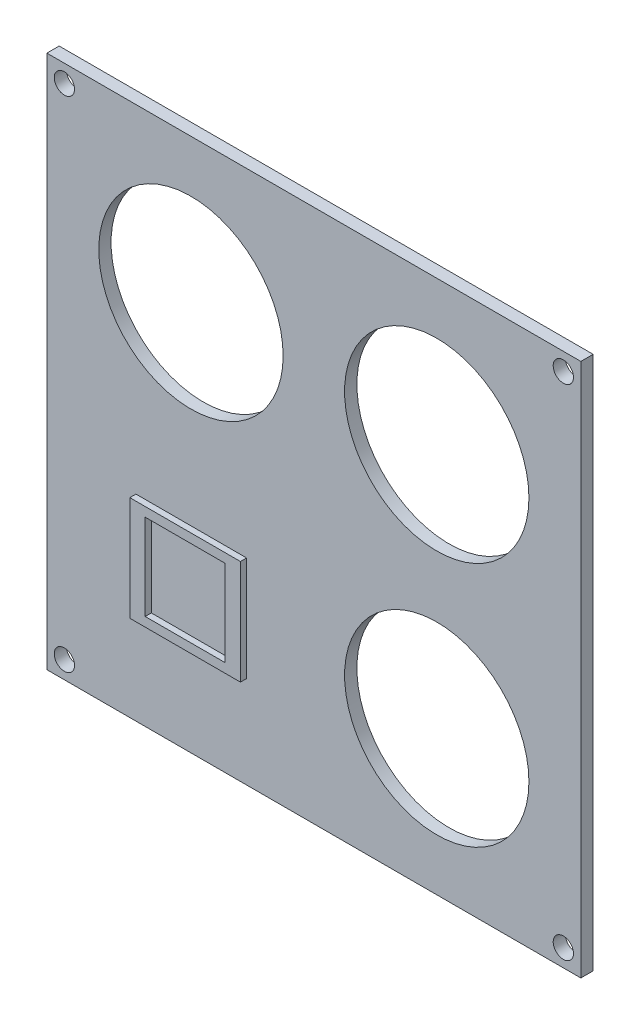
ISO-10303-21;
HEADER;
FILE_DESCRIPTION(('STEP AP214'),'2;1');
FILE_NAME('part.step','',(''),(''),'','','');
FILE_SCHEMA(('AUTOMOTIVE_DESIGN { 1 0 10303 214 1 1 1 1 }'));
ENDSEC;
DATA;
#1=APPLICATION_CONTEXT('core data for automotive mechanical design processes');
#2=APPLICATION_PROTOCOL_DEFINITION('international standard','automotive_design',2000,#1);
#3=PRODUCT_CONTEXT('',#1,'mechanical');
#4=PRODUCT('Part','Part','',(#3));
#5=PRODUCT_RELATED_PRODUCT_CATEGORY('part','',(#4));
#6=PRODUCT_DEFINITION_FORMATION('','',#4);
#7=PRODUCT_DEFINITION_CONTEXT('part definition',#1,'design');
#8=PRODUCT_DEFINITION('design','',#6,#7);
#9=PRODUCT_DEFINITION_SHAPE('','',#8);
#10=(LENGTH_UNIT() NAMED_UNIT(*) SI_UNIT(.MILLI.,.METRE.));
#11=(NAMED_UNIT(*) PLANE_ANGLE_UNIT() SI_UNIT($,.RADIAN.));
#12=(NAMED_UNIT(*) SI_UNIT($,.STERADIAN.) SOLID_ANGLE_UNIT());
#13=UNCERTAINTY_MEASURE_WITH_UNIT(LENGTH_MEASURE(1.E-05),#10,'distance_accuracy_value','');
#14=(GEOMETRIC_REPRESENTATION_CONTEXT(3) GLOBAL_UNCERTAINTY_ASSIGNED_CONTEXT((#13)) GLOBAL_UNIT_ASSIGNED_CONTEXT((#10,
#11,#12)) REPRESENTATION_CONTEXT('',''));
#15=CARTESIAN_POINT('',(0.,0.,0.));
#16=DIRECTION('',(0.,0.,1.));
#17=DIRECTION('',(1.,0.,0.));
#18=AXIS2_PLACEMENT_3D('',#15,#16,#17);
#19=CARTESIAN_POINT('',(0.,0.,2.));
#20=DIRECTION('',(0.,0.,-1.));
#21=DIRECTION('',(-1.,0.,0.));
#22=AXIS2_PLACEMENT_3D('',#19,#20,#21);
#23=PLANE('',#22);
#24=CARTESIAN_POINT('',(-63.45,63.45,2.));
#25=DIRECTION('',(0.,0.,1.));
#26=DIRECTION('',(1.,0.,0.));
#27=AXIS2_PLACEMENT_3D('',#24,#25,#26);
#28=CIRCLE('',#27,15.);
#29=CARTESIAN_POINT('',(-48.45,63.45,2.));
#30=VERTEX_POINT('',#29);
#31=EDGE_CURVE('E519',#30,#30,#28,.T.);
#32=ORIENTED_EDGE('',*,*,#31,.F.);
#33=EDGE_LOOP('',(#32));
#34=FACE_BOUND('',#33,.T.);
#35=CARTESIAN_POINT('',(-23.45,63.45,2.));
#36=DIRECTION('',(0.,0.,1.));
#37=DIRECTION('',(1.,0.,0.));
#38=AXIS2_PLACEMENT_3D('',#35,#36,#37);
#39=CIRCLE('',#38,15.);
#40=CARTESIAN_POINT('',(-8.44999999999999,63.45,2.));
#41=VERTEX_POINT('',#40);
#42=EDGE_CURVE('E522',#41,#41,#39,.T.);
#43=ORIENTED_EDGE('',*,*,#42,.F.);
#44=EDGE_LOOP('',(#43));
#45=FACE_BOUND('',#44,.T.);
#46=CARTESIAN_POINT('',(-23.45,23.45,2.));
#47=DIRECTION('',(0.,0.,1.));
#48=DIRECTION('',(1.,0.,0.));
#49=AXIS2_PLACEMENT_3D('',#46,#47,#48);
#50=CIRCLE('',#49,15.);
#51=CARTESIAN_POINT('',(-8.44999999999999,23.45,2.));
#52=VERTEX_POINT('',#51);
#53=EDGE_CURVE('E535',#52,#52,#50,.T.);
#54=ORIENTED_EDGE('',*,*,#53,.F.);
#55=EDGE_LOOP('',(#54));
#56=FACE_BOUND('',#55,.T.);
#57=DIRECTION('',(-1.,0.,0.));
#58=VECTOR('',#57,1.);
#59=CARTESIAN_POINT('',(0.,0.,2.));
#60=LINE('',#59,#58);
#61=CARTESIAN_POINT('',(0.,0.,2.));
#62=VERTEX_POINT('',#61);
#63=CARTESIAN_POINT('',(-86.9,0.,2.));
#64=VERTEX_POINT('',#63);
#65=EDGE_CURVE('E264',#62,#64,#60,.T.);
#66=ORIENTED_EDGE('',*,*,#65,.F.);
#67=DIRECTION('',(0.,1.,0.));
#68=VECTOR('',#67,1.);
#69=CARTESIAN_POINT('',(0.,0.,2.));
#70=LINE('',#69,#68);
#71=CARTESIAN_POINT('',(0.,86.9,2.));
#72=VERTEX_POINT('',#71);
#73=EDGE_CURVE('E280',#62,#72,#70,.T.);
#74=ORIENTED_EDGE('',*,*,#73,.T.);
#75=DIRECTION('',(-1.,0.,0.));
#76=VECTOR('',#75,1.);
#77=CARTESIAN_POINT('',(0.,86.9,2.));
#78=LINE('',#77,#76);
#79=CARTESIAN_POINT('',(-86.9,86.9,2.));
#80=VERTEX_POINT('',#79);
#81=EDGE_CURVE('E273',#72,#80,#78,.T.);
#82=ORIENTED_EDGE('',*,*,#81,.T.);
#83=DIRECTION('',(0.,1.,0.));
#84=VECTOR('',#83,1.);
#85=CARTESIAN_POINT('',(-86.9,0.,2.));
#86=LINE('',#85,#84);
#87=EDGE_CURVE('E267',#64,#80,#86,.T.);
#88=ORIENTED_EDGE('',*,*,#87,.F.);
#89=EDGE_LOOP('',(#66,#74,#82,#88));
#90=FACE_BOUND('',#89,.T.);
#91=CARTESIAN_POINT('',(-84.05,2.85000000000001,2.));
#92=DIRECTION('',(0.,0.,1.));
#93=DIRECTION('',(1.,0.,0.));
#94=AXIS2_PLACEMENT_3D('',#91,#92,#93);
#95=CIRCLE('',#94,1.65);
#96=CARTESIAN_POINT('',(-82.4,2.85000000000001,2.));
#97=VERTEX_POINT('',#96);
#98=EDGE_CURVE('E240',#97,#97,#95,.T.);
#99=ORIENTED_EDGE('',*,*,#98,.F.);
#100=EDGE_LOOP('',(#99));
#101=FACE_BOUND('',#100,.T.);
#102=CARTESIAN_POINT('',(-2.85,2.84999999999999,2.));
#103=DIRECTION('',(0.,0.,1.));
#104=DIRECTION('',(1.,0.,0.));
#105=AXIS2_PLACEMENT_3D('',#102,#103,#104);
#106=CIRCLE('',#105,1.65);
#107=CARTESIAN_POINT('',(-1.2,2.84999999999999,2.));
#108=VERTEX_POINT('',#107);
#109=EDGE_CURVE('E234',#108,#108,#106,.T.);
#110=ORIENTED_EDGE('',*,*,#109,.F.);
#111=EDGE_LOOP('',(#110));
#112=FACE_BOUND('',#111,.T.);
#113=CARTESIAN_POINT('',(-2.84999999999997,84.05,2.));
#114=DIRECTION('',(0.,0.,1.));
#115=DIRECTION('',(1.,0.,0.));
#116=AXIS2_PLACEMENT_3D('',#113,#114,#115);
#117=CIRCLE('',#116,1.65);
#118=CARTESIAN_POINT('',(-1.19999999999997,84.05,2.));
#119=VERTEX_POINT('',#118);
#120=EDGE_CURVE('E245',#119,#119,#117,.T.);
#121=ORIENTED_EDGE('',*,*,#120,.F.);
#122=EDGE_LOOP('',(#121));
#123=FACE_BOUND('',#122,.T.);
#124=CARTESIAN_POINT('',(-84.05,84.05,2.));
#125=DIRECTION('',(0.,0.,1.));
#126=DIRECTION('',(1.,0.,0.));
#127=AXIS2_PLACEMENT_3D('',#124,#125,#126);
#128=CIRCLE('',#127,1.65);
#129=CARTESIAN_POINT('',(-82.4,84.05,2.));
#130=VERTEX_POINT('',#129);
#131=EDGE_CURVE('E248',#130,#130,#128,.T.);
#132=ORIENTED_EDGE('',*,*,#131,.F.);
#133=EDGE_LOOP('',(#132));
#134=FACE_BOUND('',#133,.T.);
#135=DIRECTION('',(0.,-1.,0.));
#136=VECTOR('',#135,1.);
#137=CARTESIAN_POINT('',(-72.3999999999999,14.9999999999999,2.));
#138=LINE('',#137,#136);
#139=CARTESIAN_POINT('',(-72.3999999999999,31.9999999999999,2.));
#140=VERTEX_POINT('',#139);
#141=CARTESIAN_POINT('',(-72.3999999999999,14.9999999999999,2.));
#142=VERTEX_POINT('',#141);
#143=EDGE_CURVE('E72',#140,#142,#138,.T.);
#144=ORIENTED_EDGE('',*,*,#143,.F.);
#145=DIRECTION('',(-1.,0.,0.));
#146=VECTOR('',#145,1.);
#147=CARTESIAN_POINT('',(-72.3999999999999,31.9999999999999,2.));
#148=LINE('',#147,#146);
#149=CARTESIAN_POINT('',(-54.3999999999999,31.9999999999999,2.));
#150=VERTEX_POINT('',#149);
#151=EDGE_CURVE('E193',#150,#140,#148,.T.);
#152=ORIENTED_EDGE('',*,*,#151,.F.);
#153=DIRECTION('',(0.,1.,0.));
#154=VECTOR('',#153,1.);
#155=CARTESIAN_POINT('',(-54.3999999999999,14.9999999999999,2.));
#156=LINE('',#155,#154);
#157=CARTESIAN_POINT('',(-54.3999999999999,14.9999999999999,2.));
#158=VERTEX_POINT('',#157);
#159=EDGE_CURVE('E211',#158,#150,#156,.T.);
#160=ORIENTED_EDGE('',*,*,#159,.F.);
#161=DIRECTION('',(1.,0.,0.));
#162=VECTOR('',#161,1.);
#163=CARTESIAN_POINT('',(-72.3999999999999,14.9999999999999,2.));
#164=LINE('',#163,#162);
#165=EDGE_CURVE('E210',#142,#158,#164,.T.);
#166=ORIENTED_EDGE('',*,*,#165,.F.);
#167=EDGE_LOOP('',(#144,#152,#160,#166));
#168=FACE_BOUND('',#167,.T.);
#169=ADVANCED_FACE('F44',(#34,#45,#56,#90,#101,#112,#123,#134,#168),#23,.F.);
#170=CARTESIAN_POINT('',(0.,0.,2.));
#171=DIRECTION('',(0.,-1.,0.));
#172=DIRECTION('',(0.,0.,-1.));
#173=AXIS2_PLACEMENT_3D('',#170,#171,#172);
#174=PLANE('',#173);
#175=DIRECTION('',(-1.,0.,0.));
#176=VECTOR('',#175,1.);
#177=CARTESIAN_POINT('',(0.,0.,0.));
#178=LINE('',#177,#176);
#179=CARTESIAN_POINT('',(0.,0.,0.));
#180=VERTEX_POINT('',#179);
#181=CARTESIAN_POINT('',(-86.9,0.,0.));
#182=VERTEX_POINT('',#181);
#183=EDGE_CURVE('E261',#180,#182,#178,.T.);
#184=ORIENTED_EDGE('',*,*,#183,.F.);
#185=DIRECTION('',(0.,0.,-1.));
#186=VECTOR('',#185,1.);
#187=CARTESIAN_POINT('',(0.,0.,2.));
#188=LINE('',#187,#186);
#189=EDGE_CURVE('E11',#62,#180,#188,.T.);
#190=ORIENTED_EDGE('',*,*,#189,.F.);
#191=ORIENTED_EDGE('',*,*,#65,.T.);
#192=DIRECTION('',(0.,0.,-1.));
#193=VECTOR('',#192,1.);
#194=CARTESIAN_POINT('',(-86.9,0.,2.));
#195=LINE('',#194,#193);
#196=EDGE_CURVE('E47',#64,#182,#195,.T.);
#197=ORIENTED_EDGE('',*,*,#196,.T.);
#198=EDGE_LOOP('',(#184,#190,#191,#197));
#199=FACE_BOUND('',#198,.T.);
#200=ADVANCED_FACE('F50',(#199),#174,.T.);
#201=CARTESIAN_POINT('',(0.,0.,2.));
#202=DIRECTION('',(-1.,0.,0.));
#203=DIRECTION('',(0.,0.,1.));
#204=AXIS2_PLACEMENT_3D('',#201,#202,#203);
#205=PLANE('',#204);
#206=DIRECTION('',(0.,1.,0.));
#207=VECTOR('',#206,1.);
#208=CARTESIAN_POINT('',(0.,0.,0.));
#209=LINE('',#208,#207);
#210=CARTESIAN_POINT('',(0.,86.9,0.));
#211=VERTEX_POINT('',#210);
#212=EDGE_CURVE('E269',#180,#211,#209,.T.);
#213=ORIENTED_EDGE('',*,*,#212,.T.);
#214=DIRECTION('',(0.,0.,-1.));
#215=VECTOR('',#214,1.);
#216=CARTESIAN_POINT('',(0.,86.9,2.));
#217=LINE('',#216,#215);
#218=EDGE_CURVE('E54',#72,#211,#217,.T.);
#219=ORIENTED_EDGE('',*,*,#218,.F.);
#220=ORIENTED_EDGE('',*,*,#73,.F.);
#221=ORIENTED_EDGE('',*,*,#189,.T.);
#222=EDGE_LOOP('',(#213,#219,#220,#221));
#223=FACE_BOUND('',#222,.T.);
#224=ADVANCED_FACE('F315',(#223),#205,.F.);
#225=CARTESIAN_POINT('',(0.,86.9,2.));
#226=DIRECTION('',(0.,-1.,0.));
#227=DIRECTION('',(0.,0.,-1.));
#228=AXIS2_PLACEMENT_3D('',#225,#226,#227);
#229=PLANE('',#228);
#230=DIRECTION('',(-1.,0.,0.));
#231=VECTOR('',#230,1.);
#232=CARTESIAN_POINT('',(0.,86.9,0.));
#233=LINE('',#232,#231);
#234=CARTESIAN_POINT('',(-86.9,86.9,0.));
#235=VERTEX_POINT('',#234);
#236=EDGE_CURVE('E290',#211,#235,#233,.T.);
#237=ORIENTED_EDGE('',*,*,#236,.T.);
#238=DIRECTION('',(0.,0.,-1.));
#239=VECTOR('',#238,1.);
#240=CARTESIAN_POINT('',(-86.9,86.9,2.));
#241=LINE('',#240,#239);
#242=EDGE_CURVE('E293',#80,#235,#241,.T.);
#243=ORIENTED_EDGE('',*,*,#242,.F.);
#244=ORIENTED_EDGE('',*,*,#81,.F.);
#245=ORIENTED_EDGE('',*,*,#218,.T.);
#246=EDGE_LOOP('',(#237,#243,#244,#245));
#247=FACE_BOUND('',#246,.T.);
#248=ADVANCED_FACE('F316',(#247),#229,.F.);
#249=CARTESIAN_POINT('',(-86.9,0.,2.));
#250=DIRECTION('',(-1.,0.,0.));
#251=DIRECTION('',(0.,0.,1.));
#252=AXIS2_PLACEMENT_3D('',#249,#250,#251);
#253=PLANE('',#252);
#254=DIRECTION('',(0.,1.,0.));
#255=VECTOR('',#254,1.);
#256=CARTESIAN_POINT('',(-86.9,0.,0.));
#257=LINE('',#256,#255);
#258=EDGE_CURVE('E283',#182,#235,#257,.T.);
#259=ORIENTED_EDGE('',*,*,#258,.F.);
#260=ORIENTED_EDGE('',*,*,#196,.F.);
#261=ORIENTED_EDGE('',*,*,#87,.T.);
#262=ORIENTED_EDGE('',*,*,#242,.T.);
#263=EDGE_LOOP('',(#259,#260,#261,#262));
#264=FACE_BOUND('',#263,.T.);
#265=ADVANCED_FACE('F303',(#264),#253,.T.);
#266=CARTESIAN_POINT('',(0.,0.,0.));
#267=DIRECTION('',(0.,0.,-1.));
#268=DIRECTION('',(-1.,0.,0.));
#269=AXIS2_PLACEMENT_3D('',#266,#267,#268);
#270=PLANE('',#269);
#271=CARTESIAN_POINT('',(-63.45,63.45,0.));
#272=DIRECTION('',(0.,0.,1.));
#273=DIRECTION('',(1.,0.,0.));
#274=AXIS2_PLACEMENT_3D('',#271,#272,#273);
#275=CIRCLE('',#274,15.);
#276=CARTESIAN_POINT('',(-48.45,63.45,0.));
#277=VERTEX_POINT('',#276);
#278=EDGE_CURVE('E177',#277,#277,#275,.T.);
#279=ORIENTED_EDGE('',*,*,#278,.T.);
#280=EDGE_LOOP('',(#279));
#281=FACE_BOUND('',#280,.T.);
#282=CARTESIAN_POINT('',(-23.45,63.45,0.));
#283=DIRECTION('',(0.,0.,1.));
#284=DIRECTION('',(1.,0.,0.));
#285=AXIS2_PLACEMENT_3D('',#282,#283,#284);
#286=CIRCLE('',#285,15.);
#287=CARTESIAN_POINT('',(-8.44999999999999,63.45,0.));
#288=VERTEX_POINT('',#287);
#289=EDGE_CURVE('E527',#288,#288,#286,.T.);
#290=ORIENTED_EDGE('',*,*,#289,.T.);
#291=EDGE_LOOP('',(#290));
#292=FACE_BOUND('',#291,.T.);
#293=CARTESIAN_POINT('',(-23.45,23.45,0.));
#294=DIRECTION('',(0.,0.,1.));
#295=DIRECTION('',(1.,0.,0.));
#296=AXIS2_PLACEMENT_3D('',#293,#294,#295);
#297=CIRCLE('',#296,15.);
#298=CARTESIAN_POINT('',(-8.44999999999999,23.45,0.));
#299=VERTEX_POINT('',#298);
#300=EDGE_CURVE('E167',#299,#299,#297,.T.);
#301=ORIENTED_EDGE('',*,*,#300,.T.);
#302=EDGE_LOOP('',(#301));
#303=FACE_BOUND('',#302,.T.);
#304=CARTESIAN_POINT('',(-84.05,84.05,0.));
#305=DIRECTION('',(0.,0.,1.));
#306=DIRECTION('',(1.,0.,0.));
#307=AXIS2_PLACEMENT_3D('',#304,#305,#306);
#308=CIRCLE('',#307,1.65);
#309=CARTESIAN_POINT('',(-82.4,84.05,0.));
#310=VERTEX_POINT('',#309);
#311=EDGE_CURVE('E235',#310,#310,#308,.T.);
#312=ORIENTED_EDGE('',*,*,#311,.T.);
#313=EDGE_LOOP('',(#312));
#314=FACE_BOUND('',#313,.T.);
#315=CARTESIAN_POINT('',(-2.84999999999997,84.05,0.));
#316=DIRECTION('',(0.,0.,1.));
#317=DIRECTION('',(1.,0.,0.));
#318=AXIS2_PLACEMENT_3D('',#315,#316,#317);
#319=CIRCLE('',#318,1.65);
#320=CARTESIAN_POINT('',(-1.19999999999997,84.05,0.));
#321=VERTEX_POINT('',#320);
#322=EDGE_CURVE('E247',#321,#321,#319,.T.);
#323=ORIENTED_EDGE('',*,*,#322,.T.);
#324=EDGE_LOOP('',(#323));
#325=FACE_BOUND('',#324,.T.);
#326=CARTESIAN_POINT('',(-2.85,2.84999999999999,0.));
#327=DIRECTION('',(0.,0.,1.));
#328=DIRECTION('',(1.,0.,0.));
#329=AXIS2_PLACEMENT_3D('',#326,#327,#328);
#330=CIRCLE('',#329,1.65);
#331=CARTESIAN_POINT('',(-1.2,2.84999999999999,0.));
#332=VERTEX_POINT('',#331);
#333=EDGE_CURVE('E236',#332,#332,#330,.T.);
#334=ORIENTED_EDGE('',*,*,#333,.T.);
#335=EDGE_LOOP('',(#334));
#336=FACE_BOUND('',#335,.T.);
#337=CARTESIAN_POINT('',(-84.05,2.85000000000001,0.));
#338=DIRECTION('',(0.,0.,1.));
#339=DIRECTION('',(1.,0.,0.));
#340=AXIS2_PLACEMENT_3D('',#337,#338,#339);
#341=CIRCLE('',#340,1.65);
#342=CARTESIAN_POINT('',(-82.4,2.85000000000001,0.));
#343=VERTEX_POINT('',#342);
#344=EDGE_CURVE('E260',#343,#343,#341,.T.);
#345=ORIENTED_EDGE('',*,*,#344,.T.);
#346=EDGE_LOOP('',(#345));
#347=FACE_BOUND('',#346,.T.);
#348=ORIENTED_EDGE('',*,*,#183,.T.);
#349=ORIENTED_EDGE('',*,*,#258,.T.);
#350=ORIENTED_EDGE('',*,*,#236,.F.);
#351=ORIENTED_EDGE('',*,*,#212,.F.);
#352=EDGE_LOOP('',(#348,#349,#350,#351));
#353=FACE_BOUND('',#352,.T.);
#354=ADVANCED_FACE('F310',(#281,#292,#303,#314,#325,#336,#347,#353),#270,.T.);
#355=CARTESIAN_POINT('',(-84.05,2.85000000000001,0.));
#356=DIRECTION('',(0.,0.,1.));
#357=DIRECTION('',(1.,0.,0.));
#358=AXIS2_PLACEMENT_3D('',#355,#356,#357);
#359=CYLINDRICAL_SURFACE('',#358,1.65);
#360=ORIENTED_EDGE('',*,*,#344,.F.);
#361=EDGE_LOOP('',(#360));
#362=FACE_BOUND('',#361,.T.);
#363=ORIENTED_EDGE('',*,*,#98,.T.);
#364=EDGE_LOOP('',(#363));
#365=FACE_BOUND('',#364,.T.);
#366=ADVANCED_FACE('F349',(#362,#365),#359,.F.);
#367=CARTESIAN_POINT('',(-2.85,2.84999999999999,0.));
#368=DIRECTION('',(0.,0.,1.));
#369=DIRECTION('',(1.,0.,0.));
#370=AXIS2_PLACEMENT_3D('',#367,#368,#369);
#371=CYLINDRICAL_SURFACE('',#370,1.65);
#372=ORIENTED_EDGE('',*,*,#333,.F.);
#373=EDGE_LOOP('',(#372));
#374=FACE_BOUND('',#373,.T.);
#375=ORIENTED_EDGE('',*,*,#109,.T.);
#376=EDGE_LOOP('',(#375));
#377=FACE_BOUND('',#376,.T.);
#378=ADVANCED_FACE('F344',(#374,#377),#371,.F.);
#379=CARTESIAN_POINT('',(-2.84999999999997,84.05,0.));
#380=DIRECTION('',(0.,0.,1.));
#381=DIRECTION('',(1.,0.,0.));
#382=AXIS2_PLACEMENT_3D('',#379,#380,#381);
#383=CYLINDRICAL_SURFACE('',#382,1.65);
#384=ORIENTED_EDGE('',*,*,#322,.F.);
#385=EDGE_LOOP('',(#384));
#386=FACE_BOUND('',#385,.T.);
#387=ORIENTED_EDGE('',*,*,#120,.T.);
#388=EDGE_LOOP('',(#387));
#389=FACE_BOUND('',#388,.T.);
#390=ADVANCED_FACE('F334',(#386,#389),#383,.F.);
#391=CARTESIAN_POINT('',(-84.05,84.05,0.));
#392=DIRECTION('',(0.,0.,1.));
#393=DIRECTION('',(1.,0.,0.));
#394=AXIS2_PLACEMENT_3D('',#391,#392,#393);
#395=CYLINDRICAL_SURFACE('',#394,1.65);
#396=ORIENTED_EDGE('',*,*,#311,.F.);
#397=EDGE_LOOP('',(#396));
#398=FACE_BOUND('',#397,.T.);
#399=ORIENTED_EDGE('',*,*,#131,.T.);
#400=EDGE_LOOP('',(#399));
#401=FACE_BOUND('',#400,.T.);
#402=ADVANCED_FACE('F329',(#398,#401),#395,.F.);
#403=CARTESIAN_POINT('',(-72.3999999999999,14.9999999999999,3.));
#404=DIRECTION('',(1.,0.,0.));
#405=DIRECTION('',(0.,0.,-1.));
#406=AXIS2_PLACEMENT_3D('',#403,#404,#405);
#407=PLANE('',#406);
#408=ORIENTED_EDGE('',*,*,#143,.T.);
#409=DIRECTION('',(0.,0.,-1.));
#410=VECTOR('',#409,1.);
#411=CARTESIAN_POINT('',(-72.3999999999999,14.9999999999999,3.));
#412=LINE('',#411,#410);
#413=CARTESIAN_POINT('',(-72.3999999999999,14.9999999999999,3.));
#414=VERTEX_POINT('',#413);
#415=EDGE_CURVE('E228',#414,#142,#412,.T.);
#416=ORIENTED_EDGE('',*,*,#415,.F.);
#417=DIRECTION('',(0.,-1.,0.));
#418=VECTOR('',#417,1.);
#419=CARTESIAN_POINT('',(-72.3999999999999,14.9999999999999,3.));
#420=LINE('',#419,#418);
#421=CARTESIAN_POINT('',(-72.3999999999999,31.9999999999999,3.));
#422=VERTEX_POINT('',#421);
#423=EDGE_CURVE('E186',#422,#414,#420,.T.);
#424=ORIENTED_EDGE('',*,*,#423,.F.);
#425=DIRECTION('',(0.,0.,-1.));
#426=VECTOR('',#425,1.);
#427=CARTESIAN_POINT('',(-72.3999999999999,31.9999999999999,3.));
#428=LINE('',#427,#426);
#429=EDGE_CURVE('E204',#422,#140,#428,.T.);
#430=ORIENTED_EDGE('',*,*,#429,.T.);
#431=EDGE_LOOP('',(#408,#416,#424,#430));
#432=FACE_BOUND('',#431,.T.);
#433=ADVANCED_FACE('F335',(#432),#407,.F.);
#434=CARTESIAN_POINT('',(-72.3999999999999,14.9999999999999,3.));
#435=DIRECTION('',(0.,1.,0.));
#436=DIRECTION('',(0.,0.,1.));
#437=AXIS2_PLACEMENT_3D('',#434,#435,#436);
#438=PLANE('',#437);
#439=ORIENTED_EDGE('',*,*,#165,.T.);
#440=DIRECTION('',(0.,0.,-1.));
#441=VECTOR('',#440,1.);
#442=CARTESIAN_POINT('',(-54.3999999999999,14.9999999999999,3.));
#443=LINE('',#442,#441);
#444=CARTESIAN_POINT('',(-54.3999999999999,14.9999999999999,3.));
#445=VERTEX_POINT('',#444);
#446=EDGE_CURVE('E221',#445,#158,#443,.T.);
#447=ORIENTED_EDGE('',*,*,#446,.F.);
#448=DIRECTION('',(1.,0.,0.));
#449=VECTOR('',#448,1.);
#450=CARTESIAN_POINT('',(-72.3999999999999,14.9999999999999,3.));
#451=LINE('',#450,#449);
#452=EDGE_CURVE('E191',#414,#445,#451,.T.);
#453=ORIENTED_EDGE('',*,*,#452,.F.);
#454=ORIENTED_EDGE('',*,*,#415,.T.);
#455=EDGE_LOOP('',(#439,#447,#453,#454));
#456=FACE_BOUND('',#455,.T.);
#457=ADVANCED_FACE('F336',(#456),#438,.F.);
#458=CARTESIAN_POINT('',(-54.3999999999999,14.9999999999999,3.));
#459=DIRECTION('',(-1.,0.,0.));
#460=DIRECTION('',(0.,0.,1.));
#461=AXIS2_PLACEMENT_3D('',#458,#459,#460);
#462=PLANE('',#461);
#463=ORIENTED_EDGE('',*,*,#159,.T.);
#464=DIRECTION('',(0.,0.,-1.));
#465=VECTOR('',#464,1.);
#466=CARTESIAN_POINT('',(-54.3999999999999,31.9999999999999,3.));
#467=LINE('',#466,#465);
#468=CARTESIAN_POINT('',(-54.3999999999999,31.9999999999999,3.));
#469=VERTEX_POINT('',#468);
#470=EDGE_CURVE('E219',#469,#150,#467,.T.);
#471=ORIENTED_EDGE('',*,*,#470,.F.);
#472=DIRECTION('',(0.,1.,0.));
#473=VECTOR('',#472,1.);
#474=CARTESIAN_POINT('',(-54.3999999999999,14.9999999999999,3.));
#475=LINE('',#474,#473);
#476=EDGE_CURVE('E196',#445,#469,#475,.T.);
#477=ORIENTED_EDGE('',*,*,#476,.F.);
#478=ORIENTED_EDGE('',*,*,#446,.T.);
#479=EDGE_LOOP('',(#463,#471,#477,#478));
#480=FACE_BOUND('',#479,.T.);
#481=ADVANCED_FACE('F410',(#480),#462,.F.);
#482=CARTESIAN_POINT('',(-72.3999999999999,31.9999999999999,3.));
#483=DIRECTION('',(0.,-1.,0.));
#484=DIRECTION('',(0.,0.,-1.));
#485=AXIS2_PLACEMENT_3D('',#482,#483,#484);
#486=PLANE('',#485);
#487=ORIENTED_EDGE('',*,*,#151,.T.);
#488=ORIENTED_EDGE('',*,*,#429,.F.);
#489=DIRECTION('',(-1.,0.,0.));
#490=VECTOR('',#489,1.);
#491=CARTESIAN_POINT('',(-72.3999999999999,31.9999999999999,3.));
#492=LINE('',#491,#490);
#493=EDGE_CURVE('E203',#469,#422,#492,.T.);
#494=ORIENTED_EDGE('',*,*,#493,.F.);
#495=ORIENTED_EDGE('',*,*,#470,.T.);
#496=EDGE_LOOP('',(#487,#488,#494,#495));
#497=FACE_BOUND('',#496,.T.);
#498=ADVANCED_FACE('F417',(#497),#486,.F.);
#499=CARTESIAN_POINT('',(0.,0.,3.));
#500=DIRECTION('',(0.,0.,-1.));
#501=DIRECTION('',(-1.,0.,0.));
#502=AXIS2_PLACEMENT_3D('',#499,#500,#501);
#503=PLANE('',#502);
#504=DIRECTION('',(1.,0.,0.));
#505=VECTOR('',#504,1.);
#506=CARTESIAN_POINT('',(-69.8999999999999,16.4999999999999,3.));
#507=LINE('',#506,#505);
#508=CARTESIAN_POINT('',(-69.8999999999999,16.4999999999999,3.));
#509=VERTEX_POINT('',#508);
#510=CARTESIAN_POINT('',(-56.8999999999999,16.4999999999999,3.));
#511=VERTEX_POINT('',#510);
#512=EDGE_CURVE('E171',#509,#511,#507,.T.);
#513=ORIENTED_EDGE('',*,*,#512,.F.);
#514=DIRECTION('',(0.,-1.,0.));
#515=VECTOR('',#514,1.);
#516=CARTESIAN_POINT('',(-69.8999999999999,30.4999999999999,3.));
#517=LINE('',#516,#515);
#518=CARTESIAN_POINT('',(-69.8999999999999,30.4999999999999,3.));
#519=VERTEX_POINT('',#518);
#520=EDGE_CURVE('E63',#519,#509,#517,.T.);
#521=ORIENTED_EDGE('',*,*,#520,.F.);
#522=DIRECTION('',(-1.,0.,0.));
#523=VECTOR('',#522,1.);
#524=CARTESIAN_POINT('',(-69.8999999999999,30.4999999999999,3.));
#525=LINE('',#524,#523);
#526=CARTESIAN_POINT('',(-56.8999999999999,30.4999999999999,3.));
#527=VERTEX_POINT('',#526);
#528=EDGE_CURVE('E157',#527,#519,#525,.T.);
#529=ORIENTED_EDGE('',*,*,#528,.F.);
#530=DIRECTION('',(0.,1.,0.));
#531=VECTOR('',#530,1.);
#532=CARTESIAN_POINT('',(-56.8999999999999,30.4999999999999,3.));
#533=LINE('',#532,#531);
#534=EDGE_CURVE('E162',#511,#527,#533,.T.);
#535=ORIENTED_EDGE('',*,*,#534,.F.);
#536=EDGE_LOOP('',(#513,#521,#529,#535));
#537=FACE_BOUND('',#536,.T.);
#538=ORIENTED_EDGE('',*,*,#423,.T.);
#539=ORIENTED_EDGE('',*,*,#452,.T.);
#540=ORIENTED_EDGE('',*,*,#476,.T.);
#541=ORIENTED_EDGE('',*,*,#493,.T.);
#542=EDGE_LOOP('',(#538,#539,#540,#541));
#543=FACE_BOUND('',#542,.T.);
#544=ADVANCED_FACE('F430',(#537,#543),#503,.F.);
#545=CARTESIAN_POINT('',(-69.8999999999999,30.4999999999999,2.));
#546=DIRECTION('',(-1.,0.,0.));
#547=DIRECTION('',(0.,0.,1.));
#548=AXIS2_PLACEMENT_3D('',#545,#546,#547);
#549=PLANE('',#548);
#550=ORIENTED_EDGE('',*,*,#520,.T.);
#551=DIRECTION('',(0.,0.,1.));
#552=VECTOR('',#551,1.);
#553=CARTESIAN_POINT('',(-69.8999999999999,16.4999999999999,2.));
#554=LINE('',#553,#552);
#555=CARTESIAN_POINT('',(-69.8999999999999,16.4999999999999,2.));
#556=VERTEX_POINT('',#555);
#557=EDGE_CURVE('E134',#556,#509,#554,.T.);
#558=ORIENTED_EDGE('',*,*,#557,.F.);
#559=DIRECTION('',(0.,-1.,0.));
#560=VECTOR('',#559,1.);
#561=CARTESIAN_POINT('',(-69.8999999999999,30.4999999999999,2.));
#562=LINE('',#561,#560);
#563=CARTESIAN_POINT('',(-69.8999999999999,30.4999999999999,2.));
#564=VERTEX_POINT('',#563);
#565=EDGE_CURVE('E139',#564,#556,#562,.T.);
#566=ORIENTED_EDGE('',*,*,#565,.F.);
#567=DIRECTION('',(0.,0.,1.));
#568=VECTOR('',#567,1.);
#569=CARTESIAN_POINT('',(-69.8999999999999,30.4999999999999,2.));
#570=LINE('',#569,#568);
#571=EDGE_CURVE('E185',#564,#519,#570,.T.);
#572=ORIENTED_EDGE('',*,*,#571,.T.);
#573=EDGE_LOOP('',(#550,#558,#566,#572));
#574=FACE_BOUND('',#573,.T.);
#575=ADVANCED_FACE('F137',(#574),#549,.F.);
#576=CARTESIAN_POINT('',(-69.8999999999999,30.4999999999999,2.));
#577=DIRECTION('',(0.,1.,0.));
#578=DIRECTION('',(0.,0.,1.));
#579=AXIS2_PLACEMENT_3D('',#576,#577,#578);
#580=PLANE('',#579);
#581=ORIENTED_EDGE('',*,*,#528,.T.);
#582=ORIENTED_EDGE('',*,*,#571,.F.);
#583=DIRECTION('',(-1.,0.,0.));
#584=VECTOR('',#583,1.);
#585=CARTESIAN_POINT('',(-69.8999999999999,30.4999999999999,2.));
#586=LINE('',#585,#584);
#587=CARTESIAN_POINT('',(-56.8999999999999,30.4999999999999,2.));
#588=VERTEX_POINT('',#587);
#589=EDGE_CURVE('E144',#588,#564,#586,.T.);
#590=ORIENTED_EDGE('',*,*,#589,.F.);
#591=DIRECTION('',(0.,0.,1.));
#592=VECTOR('',#591,1.);
#593=CARTESIAN_POINT('',(-56.8999999999999,30.4999999999999,2.));
#594=LINE('',#593,#592);
#595=EDGE_CURVE('E183',#588,#527,#594,.T.);
#596=ORIENTED_EDGE('',*,*,#595,.T.);
#597=EDGE_LOOP('',(#581,#582,#590,#596));
#598=FACE_BOUND('',#597,.T.);
#599=ADVANCED_FACE('F447',(#598),#580,.F.);
#600=CARTESIAN_POINT('',(-56.8999999999999,30.4999999999999,2.));
#601=DIRECTION('',(1.,0.,0.));
#602=DIRECTION('',(0.,1.,0.));
#603=AXIS2_PLACEMENT_3D('',#600,#601,#602);
#604=PLANE('',#603);
#605=ORIENTED_EDGE('',*,*,#534,.T.);
#606=ORIENTED_EDGE('',*,*,#595,.F.);
#607=DIRECTION('',(0.,1.,0.));
#608=VECTOR('',#607,1.);
#609=CARTESIAN_POINT('',(-56.8999999999999,30.4999999999999,2.));
#610=LINE('',#609,#608);
#611=CARTESIAN_POINT('',(-56.8999999999999,16.4999999999999,2.));
#612=VERTEX_POINT('',#611);
#613=EDGE_CURVE('E152',#612,#588,#610,.T.);
#614=ORIENTED_EDGE('',*,*,#613,.F.);
#615=DIRECTION('',(0.,0.,1.));
#616=VECTOR('',#615,1.);
#617=CARTESIAN_POINT('',(-56.8999999999999,16.4999999999999,2.));
#618=LINE('',#617,#616);
#619=EDGE_CURVE('E145',#612,#511,#618,.T.);
#620=ORIENTED_EDGE('',*,*,#619,.T.);
#621=EDGE_LOOP('',(#605,#606,#614,#620));
#622=FACE_BOUND('',#621,.T.);
#623=ADVANCED_FACE('F453',(#622),#604,.F.);
#624=CARTESIAN_POINT('',(-69.8999999999999,16.4999999999999,2.));
#625=DIRECTION('',(0.,-1.,0.));
#626=DIRECTION('',(0.,0.,-1.));
#627=AXIS2_PLACEMENT_3D('',#624,#625,#626);
#628=PLANE('',#627);
#629=ORIENTED_EDGE('',*,*,#512,.T.);
#630=ORIENTED_EDGE('',*,*,#619,.F.);
#631=DIRECTION('',(1.,0.,0.));
#632=VECTOR('',#631,1.);
#633=CARTESIAN_POINT('',(-69.8999999999999,16.4999999999999,2.));
#634=LINE('',#633,#632);
#635=EDGE_CURVE('E146',#556,#612,#634,.T.);
#636=ORIENTED_EDGE('',*,*,#635,.F.);
#637=ORIENTED_EDGE('',*,*,#557,.T.);
#638=EDGE_LOOP('',(#629,#630,#636,#637));
#639=FACE_BOUND('',#638,.T.);
#640=ADVANCED_FACE('F149',(#639),#628,.F.);
#641=CARTESIAN_POINT('',(0.,0.,2.));
#642=DIRECTION('',(0.,0.,1.));
#643=DIRECTION('',(1.,0.,0.));
#644=AXIS2_PLACEMENT_3D('',#641,#642,#643);
#645=PLANE('',#644);
#646=ORIENTED_EDGE('',*,*,#565,.T.);
#647=ORIENTED_EDGE('',*,*,#635,.T.);
#648=ORIENTED_EDGE('',*,*,#613,.T.);
#649=ORIENTED_EDGE('',*,*,#589,.T.);
#650=EDGE_LOOP('',(#646,#647,#648,#649));
#651=FACE_BOUND('',#650,.T.);
#652=ADVANCED_FACE('F156',(#651),#645,.T.);
#653=CARTESIAN_POINT('',(-23.45,23.45,0.));
#654=DIRECTION('',(0.,0.,1.));
#655=DIRECTION('',(1.,0.,0.));
#656=AXIS2_PLACEMENT_3D('',#653,#654,#655);
#657=CYLINDRICAL_SURFACE('',#656,15.);
#658=ORIENTED_EDGE('',*,*,#300,.F.);
#659=EDGE_LOOP('',(#658));
#660=FACE_BOUND('',#659,.T.);
#661=ORIENTED_EDGE('',*,*,#53,.T.);
#662=EDGE_LOOP('',(#661));
#663=FACE_BOUND('',#662,.T.);
#664=ADVANCED_FACE('F485',(#660,#663),#657,.F.);
#665=CARTESIAN_POINT('',(-23.45,63.45,0.));
#666=DIRECTION('',(0.,0.,1.));
#667=DIRECTION('',(1.,0.,0.));
#668=AXIS2_PLACEMENT_3D('',#665,#666,#667);
#669=CYLINDRICAL_SURFACE('',#668,15.);
#670=ORIENTED_EDGE('',*,*,#289,.F.);
#671=EDGE_LOOP('',(#670));
#672=FACE_BOUND('',#671,.T.);
#673=ORIENTED_EDGE('',*,*,#42,.T.);
#674=EDGE_LOOP('',(#673));
#675=FACE_BOUND('',#674,.T.);
#676=ADVANCED_FACE('F491',(#672,#675),#669,.F.);
#677=CARTESIAN_POINT('',(-63.45,63.45,0.));
#678=DIRECTION('',(0.,0.,1.));
#679=DIRECTION('',(1.,0.,0.));
#680=AXIS2_PLACEMENT_3D('',#677,#678,#679);
#681=CYLINDRICAL_SURFACE('',#680,15.);
#682=ORIENTED_EDGE('',*,*,#278,.F.);
#683=EDGE_LOOP('',(#682));
#684=FACE_BOUND('',#683,.T.);
#685=ORIENTED_EDGE('',*,*,#31,.T.);
#686=EDGE_LOOP('',(#685));
#687=FACE_BOUND('',#686,.T.);
#688=ADVANCED_FACE('F502',(#684,#687),#681,.F.);
#689=CLOSED_SHELL('',(#169,#200,#224,#248,#265,#354,#366,#378,#390,#402,#433,#457,#481,#498,
#544,#575,#599,#623,#640,#652,#664,#676,#688));
#690=MANIFOLD_SOLID_BREP('B2',#689);
#691=ADVANCED_BREP_SHAPE_REPRESENTATION('',(#18,#690),#14);
#692=SHAPE_DEFINITION_REPRESENTATION(#9,#691);
ENDSEC;
END-ISO-10303-21;
